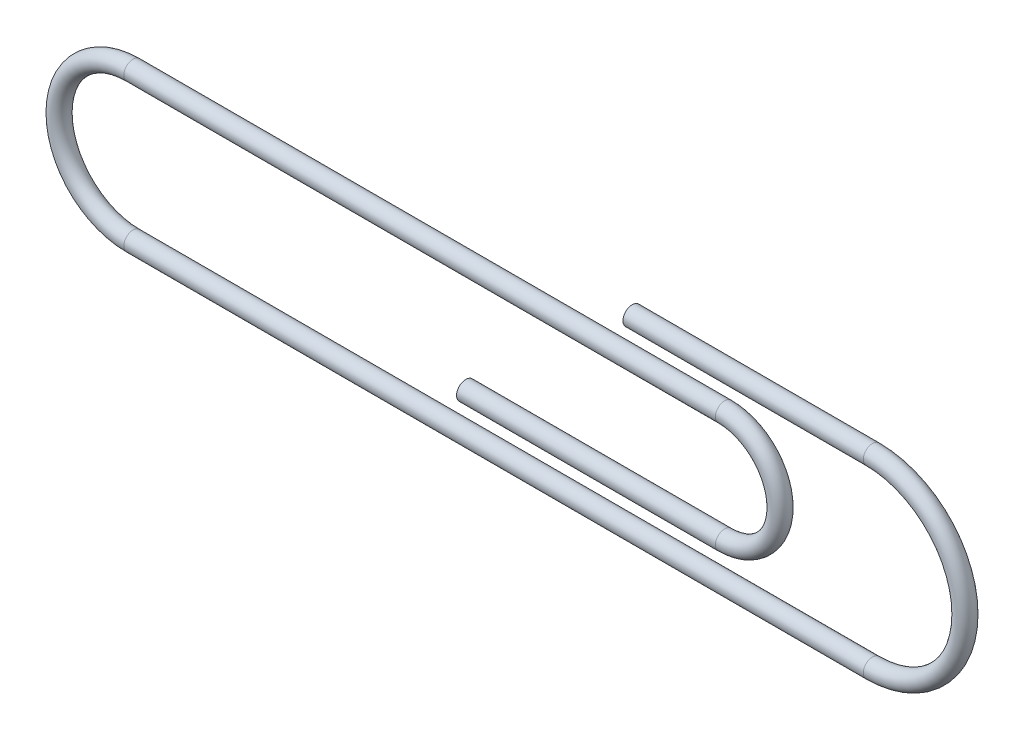
ISO-10303-21;
HEADER;
FILE_DESCRIPTION(('STEP AP214'),'2;1');
FILE_NAME('part.step','',(''),(''),'','','');
FILE_SCHEMA(('AUTOMOTIVE_DESIGN { 1 0 10303 214 1 1 1 1 }'));
ENDSEC;
DATA;
#1=APPLICATION_CONTEXT('core data for automotive mechanical design processes');
#2=APPLICATION_PROTOCOL_DEFINITION('international standard','automotive_design',2000,#1);
#3=PRODUCT_CONTEXT('',#1,'mechanical');
#4=PRODUCT('Part','Part','',(#3));
#5=PRODUCT_RELATED_PRODUCT_CATEGORY('part','',(#4));
#6=PRODUCT_DEFINITION_FORMATION('','',#4);
#7=PRODUCT_DEFINITION_CONTEXT('part definition',#1,'design');
#8=PRODUCT_DEFINITION('design','',#6,#7);
#9=PRODUCT_DEFINITION_SHAPE('','',#8);
#10=(LENGTH_UNIT() NAMED_UNIT(*) SI_UNIT(.MILLI.,.METRE.));
#11=(NAMED_UNIT(*) PLANE_ANGLE_UNIT() SI_UNIT($,.RADIAN.));
#12=(NAMED_UNIT(*) SI_UNIT($,.STERADIAN.) SOLID_ANGLE_UNIT());
#13=UNCERTAINTY_MEASURE_WITH_UNIT(LENGTH_MEASURE(1.E-05),#10,'distance_accuracy_value','');
#14=(GEOMETRIC_REPRESENTATION_CONTEXT(3) GLOBAL_UNCERTAINTY_ASSIGNED_CONTEXT((#13)) GLOBAL_UNIT_ASSIGNED_CONTEXT((#10,
#11,#12)) REPRESENTATION_CONTEXT('',''));
#15=CARTESIAN_POINT('',(0.,0.,0.));
#16=DIRECTION('',(0.,0.,1.));
#17=DIRECTION('',(1.,0.,0.));
#18=AXIS2_PLACEMENT_3D('',#15,#16,#17);
#19=CARTESIAN_POINT('',(0.,0.,0.));
#20=DIRECTION('',(1.,0.,0.));
#21=DIRECTION('',(0.,0.,-1.));
#22=AXIS2_PLACEMENT_3D('',#19,#20,#21);
#23=PLANE('',#22);
#24=CARTESIAN_POINT('',(0.,0.,0.));
#25=DIRECTION('',(1.,0.,0.));
#26=DIRECTION('',(0.,0.,-1.));
#27=AXIS2_PLACEMENT_3D('',#24,#25,#26);
#28=CIRCLE('',#27,2.5);
#29=CARTESIAN_POINT('',(0.,0.,-2.5));
#30=VERTEX_POINT('',#29);
#31=EDGE_CURVE('E52',#30,#30,#28,.T.);
#32=ORIENTED_EDGE('',*,*,#31,.F.);
#33=EDGE_LOOP('',(#32));
#34=FACE_BOUND('',#33,.T.);
#35=ADVANCED_FACE('F39',(#34),#23,.F.);
#36=CARTESIAN_POINT('',(45.,40.,0.));
#37=DIRECTION('',(-1.,0.,0.));
#38=DIRECTION('',(0.,0.,-1.));
#39=AXIS2_PLACEMENT_3D('',#36,#37,#38);
#40=PLANE('',#39);
#41=CARTESIAN_POINT('',(45.,40.,0.));
#42=DIRECTION('',(-1.,0.,0.));
#43=DIRECTION('',(0.,0.,-1.));
#44=AXIS2_PLACEMENT_3D('',#41,#42,#43);
#45=CIRCLE('',#44,2.5);
#46=CARTESIAN_POINT('',(45.,40.,-2.5));
#47=VERTEX_POINT('',#46);
#48=EDGE_CURVE('E11',#47,#47,#45,.T.);
#49=ORIENTED_EDGE('',*,*,#48,.T.);
#50=EDGE_LOOP('',(#49));
#51=FACE_BOUND('',#50,.T.);
#52=ADVANCED_FACE('F55',(#51),#40,.T.);
#53=CARTESIAN_POINT('',(0.,0.,0.));
#54=DIRECTION('',(1.,0.,0.));
#55=DIRECTION('',(0.,0.,-1.));
#56=AXIS2_PLACEMENT_3D('',#53,#54,#55);
#57=CYLINDRICAL_SURFACE('',#56,2.5);
#58=CARTESIAN_POINT('',(70.,0.,0.));
#59=DIRECTION('',(1.,0.,0.));
#60=DIRECTION('',(0.,0.,-1.));
#61=AXIS2_PLACEMENT_3D('',#58,#59,#60);
#62=CIRCLE('',#61,2.5);
#63=CARTESIAN_POINT('',(70.,-2.5,0.));
#64=VERTEX_POINT('',#63);
#65=EDGE_CURVE('E83',#64,#64,#62,.T.);
#66=ORIENTED_EDGE('',*,*,#65,.F.);
#67=EDGE_LOOP('',(#66));
#68=FACE_BOUND('',#67,.T.);
#69=ORIENTED_EDGE('',*,*,#31,.T.);
#70=EDGE_LOOP('',(#69));
#71=FACE_BOUND('',#70,.T.);
#72=ADVANCED_FACE('F89',(#68,#71),#57,.T.);
#73=CARTESIAN_POINT('',(70.,15.,0.));
#74=DIRECTION('',(0.,0.,1.));
#75=DIRECTION('',(1.,0.,0.));
#76=AXIS2_PLACEMENT_3D('',#73,#74,#75);
#77=TOROIDAL_SURFACE('',#76,15.,2.5);
#78=CARTESIAN_POINT('',(70.,30.,0.));
#79=DIRECTION('',(-1.,0.,0.));
#80=DIRECTION('',(0.,0.,-1.));
#81=AXIS2_PLACEMENT_3D('',#78,#79,#80);
#82=CIRCLE('',#81,2.5);
#83=CARTESIAN_POINT('',(70.,32.5,0.));
#84=VERTEX_POINT('',#83);
#85=EDGE_CURVE('E79',#84,#84,#82,.T.);
#86=CARTESIAN_POINT('',(70.,15.,0.));
#87=DIRECTION('',(0.,0.,1.));
#88=DIRECTION('',(1.,0.,0.));
#89=AXIS2_PLACEMENT_3D('',#86,#87,#88);
#90=CIRCLE('',#89,17.5);
#91=EDGE_CURVE('',#64,#84,#90,.T.);
#92=ORIENTED_EDGE('',*,*,#65,.T.);
#93=ORIENTED_EDGE('',*,*,#85,.F.);
#94=ORIENTED_EDGE('',*,*,#91,.T.);
#95=ORIENTED_EDGE('',*,*,#91,.F.);
#96=EDGE_LOOP('',(#92,#94,#93,#95));
#97=FACE_BOUND('',#96,.T.);
#98=ADVANCED_FACE('F91',(#97),#77,.T.);
#99=CARTESIAN_POINT('',(70.,30.,0.));
#100=DIRECTION('',(-1.,0.,0.));
#101=DIRECTION('',(0.,-1.,0.));
#102=AXIS2_PLACEMENT_3D('',#99,#100,#101);
#103=CYLINDRICAL_SURFACE('',#102,2.5);
#104=CARTESIAN_POINT('',(-90.,30.,0.));
#105=DIRECTION('',(-1.,0.,0.));
#106=DIRECTION('',(0.,0.,-1.));
#107=AXIS2_PLACEMENT_3D('',#104,#105,#106);
#108=CIRCLE('',#107,2.5);
#109=CARTESIAN_POINT('',(-90.,32.5,0.));
#110=VERTEX_POINT('',#109);
#111=EDGE_CURVE('E75',#110,#110,#108,.T.);
#112=ORIENTED_EDGE('',*,*,#111,.F.);
#113=EDGE_LOOP('',(#112));
#114=FACE_BOUND('',#113,.T.);
#115=ORIENTED_EDGE('',*,*,#85,.T.);
#116=EDGE_LOOP('',(#115));
#117=FACE_BOUND('',#116,.T.);
#118=ADVANCED_FACE('F98',(#114,#117),#103,.T.);
#119=CARTESIAN_POINT('',(-90.,9.99999999999998,0.));
#120=DIRECTION('',(0.,0.,1.));
#121=DIRECTION('',(1.,0.,0.));
#122=AXIS2_PLACEMENT_3D('',#119,#120,#121);
#123=TOROIDAL_SURFACE('',#122,20.,2.5);
#124=CARTESIAN_POINT('',(-90.,-10.,0.));
#125=DIRECTION('',(1.,0.,0.));
#126=DIRECTION('',(0.,0.,-1.));
#127=AXIS2_PLACEMENT_3D('',#124,#125,#126);
#128=CIRCLE('',#127,2.5);
#129=CARTESIAN_POINT('',(-90.,-12.5,0.));
#130=VERTEX_POINT('',#129);
#131=EDGE_CURVE('E69',#130,#130,#128,.T.);
#132=CARTESIAN_POINT('',(-90.,9.99999999999998,0.));
#133=DIRECTION('',(0.,0.,1.));
#134=DIRECTION('',(1.,0.,0.));
#135=AXIS2_PLACEMENT_3D('',#132,#133,#134);
#136=CIRCLE('',#135,22.5);
#137=EDGE_CURVE('',#110,#130,#136,.T.);
#138=ORIENTED_EDGE('',*,*,#111,.T.);
#139=ORIENTED_EDGE('',*,*,#131,.F.);
#140=ORIENTED_EDGE('',*,*,#137,.T.);
#141=ORIENTED_EDGE('',*,*,#137,.F.);
#142=EDGE_LOOP('',(#138,#140,#139,#141));
#143=FACE_BOUND('',#142,.T.);
#144=ADVANCED_FACE('F105',(#143),#123,.T.);
#145=CARTESIAN_POINT('',(-90.,-10.,0.));
#146=DIRECTION('',(1.,0.,0.));
#147=DIRECTION('',(0.,0.,-1.));
#148=AXIS2_PLACEMENT_3D('',#145,#146,#147);
#149=CYLINDRICAL_SURFACE('',#148,2.5);
#150=CARTESIAN_POINT('',(110.,-10.,0.));
#151=DIRECTION('',(1.,0.,0.));
#152=DIRECTION('',(0.,0.,-1.));
#153=AXIS2_PLACEMENT_3D('',#150,#151,#152);
#154=CIRCLE('',#153,2.5);
#155=CARTESIAN_POINT('',(110.,-12.5,0.));
#156=VERTEX_POINT('',#155);
#157=EDGE_CURVE('E66',#156,#156,#154,.T.);
#158=ORIENTED_EDGE('',*,*,#157,.F.);
#159=EDGE_LOOP('',(#158));
#160=FACE_BOUND('',#159,.T.);
#161=ORIENTED_EDGE('',*,*,#131,.T.);
#162=EDGE_LOOP('',(#161));
#163=FACE_BOUND('',#162,.T.);
#164=ADVANCED_FACE('F109',(#160,#163),#149,.T.);
#165=CARTESIAN_POINT('',(110.,15.,0.));
#166=DIRECTION('',(0.,0.,1.));
#167=DIRECTION('',(1.,0.,0.));
#168=AXIS2_PLACEMENT_3D('',#165,#166,#167);
#169=TOROIDAL_SURFACE('',#168,25.,2.5);
#170=CARTESIAN_POINT('',(110.,40.,0.));
#171=DIRECTION('',(-1.,0.,0.));
#172=DIRECTION('',(0.,0.,-1.));
#173=AXIS2_PLACEMENT_3D('',#170,#171,#172);
#174=CIRCLE('',#173,2.5);
#175=CARTESIAN_POINT('',(110.,42.5,0.));
#176=VERTEX_POINT('',#175);
#177=EDGE_CURVE('E47',#176,#176,#174,.T.);
#178=CARTESIAN_POINT('',(110.,15.,0.));
#179=DIRECTION('',(0.,0.,1.));
#180=DIRECTION('',(1.,0.,0.));
#181=AXIS2_PLACEMENT_3D('',#178,#179,#180);
#182=CIRCLE('',#181,27.5);
#183=EDGE_CURVE('',#156,#176,#182,.T.);
#184=ORIENTED_EDGE('',*,*,#157,.T.);
#185=ORIENTED_EDGE('',*,*,#177,.F.);
#186=ORIENTED_EDGE('',*,*,#183,.T.);
#187=ORIENTED_EDGE('',*,*,#183,.F.);
#188=EDGE_LOOP('',(#184,#186,#185,#187));
#189=FACE_BOUND('',#188,.T.);
#190=ADVANCED_FACE('F60',(#189),#169,.T.);
#191=CARTESIAN_POINT('',(110.,40.,0.));
#192=DIRECTION('',(-1.,0.,0.));
#193=DIRECTION('',(0.,-1.,0.));
#194=AXIS2_PLACEMENT_3D('',#191,#192,#193);
#195=CYLINDRICAL_SURFACE('',#194,2.5);
#196=ORIENTED_EDGE('',*,*,#48,.F.);
#197=EDGE_LOOP('',(#196));
#198=FACE_BOUND('',#197,.T.);
#199=ORIENTED_EDGE('',*,*,#177,.T.);
#200=EDGE_LOOP('',(#199));
#201=FACE_BOUND('',#200,.T.);
#202=ADVANCED_FACE('F57',(#198,#201),#195,.T.);
#203=CLOSED_SHELL('',(#35,#52,#72,#98,#118,#144,#164,#190,#202));
#204=MANIFOLD_SOLID_BREP('B2',#203);
#205=ADVANCED_BREP_SHAPE_REPRESENTATION('',(#18,#204),#14);
#206=SHAPE_DEFINITION_REPRESENTATION(#9,#205);
ENDSEC;
END-ISO-10303-21;
